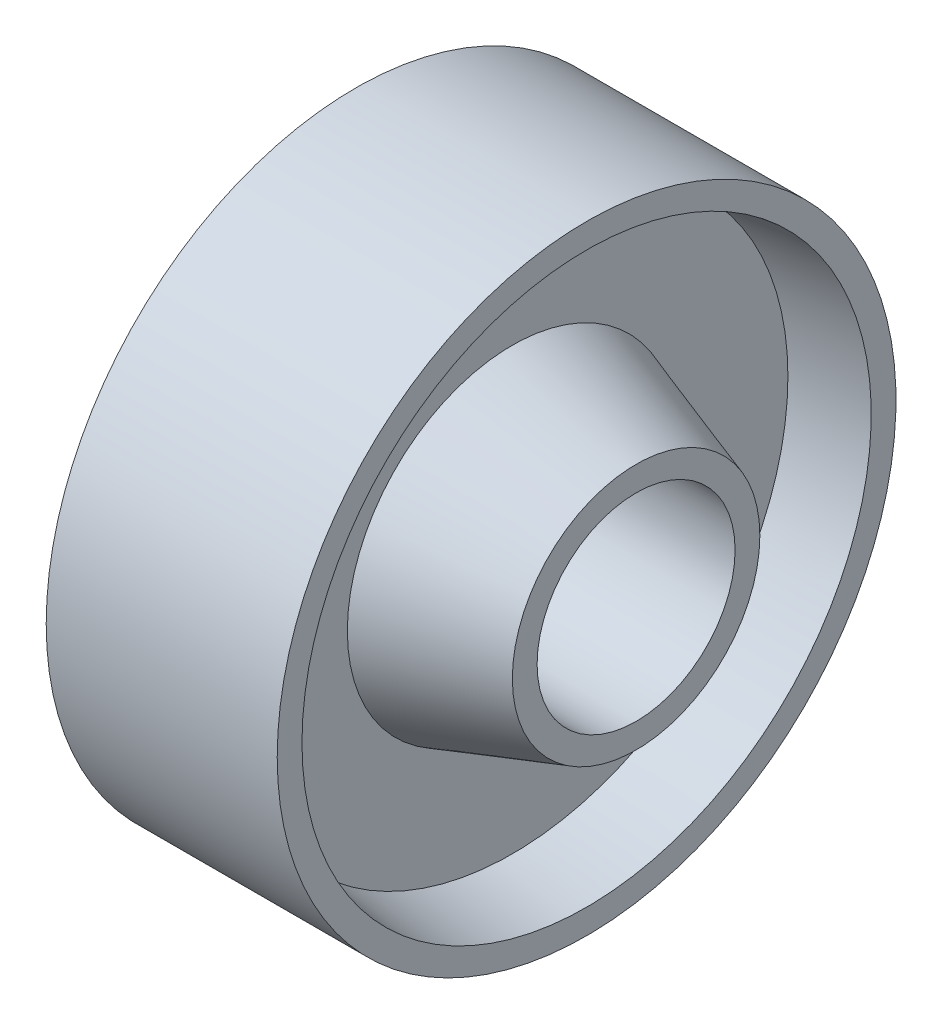
ISO-10303-21;
HEADER;
FILE_DESCRIPTION(('STEP AP214'),'2;1');
FILE_NAME('part.step','',(''),(''),'','','');
FILE_SCHEMA(('AUTOMOTIVE_DESIGN { 1 0 10303 214 1 1 1 1 }'));
ENDSEC;
DATA;
#1=APPLICATION_CONTEXT('core data for automotive mechanical design processes');
#2=APPLICATION_PROTOCOL_DEFINITION('international standard','automotive_design',2000,#1);
#3=PRODUCT_CONTEXT('',#1,'mechanical');
#4=PRODUCT('Part','Part','',(#3));
#5=PRODUCT_RELATED_PRODUCT_CATEGORY('part','',(#4));
#6=PRODUCT_DEFINITION_FORMATION('','',#4);
#7=PRODUCT_DEFINITION_CONTEXT('part definition',#1,'design');
#8=PRODUCT_DEFINITION('design','',#6,#7);
#9=PRODUCT_DEFINITION_SHAPE('','',#8);
#10=(LENGTH_UNIT() NAMED_UNIT(*) SI_UNIT(.MILLI.,.METRE.));
#11=(NAMED_UNIT(*) PLANE_ANGLE_UNIT() SI_UNIT($,.RADIAN.));
#12=(NAMED_UNIT(*) SI_UNIT($,.STERADIAN.) SOLID_ANGLE_UNIT());
#13=UNCERTAINTY_MEASURE_WITH_UNIT(LENGTH_MEASURE(1.E-05),#10,'distance_accuracy_value','');
#14=(GEOMETRIC_REPRESENTATION_CONTEXT(3) GLOBAL_UNCERTAINTY_ASSIGNED_CONTEXT((#13)) GLOBAL_UNIT_ASSIGNED_CONTEXT((#10,
#11,#12)) REPRESENTATION_CONTEXT('',''));
#15=CARTESIAN_POINT('',(0.,0.,0.));
#16=DIRECTION('',(0.,0.,1.));
#17=DIRECTION('',(1.,0.,0.));
#18=AXIS2_PLACEMENT_3D('',#15,#16,#17);
#19=CARTESIAN_POINT('',(14.,0.,0.));
#20=DIRECTION('',(1.,0.,0.));
#21=DIRECTION('',(0.,0.,-1.));
#22=AXIS2_PLACEMENT_3D('',#19,#20,#21);
#23=CONICAL_SURFACE('',#22,34.5,0.121376391577972);
#24=CARTESIAN_POINT('',(5.,0.,0.));
#25=DIRECTION('',(-1.,0.,0.));
#26=DIRECTION('',(0.,0.,1.));
#27=AXIS2_PLACEMENT_3D('',#24,#25,#26);
#28=CIRCLE('',#27,33.4022162399532);
#29=CARTESIAN_POINT('',(5.,0.,33.4022162399532));
#30=VERTEX_POINT('',#29);
#31=EDGE_CURVE('E73',#30,#30,#28,.T.);
#32=ORIENTED_EDGE('',*,*,#31,.T.);
#33=EDGE_LOOP('',(#32));
#34=FACE_BOUND('',#33,.T.);
#35=CARTESIAN_POINT('',(14.,0.,0.));
#36=DIRECTION('',(-1.,0.,0.));
#37=DIRECTION('',(0.,0.,1.));
#38=AXIS2_PLACEMENT_3D('',#35,#36,#37);
#39=CIRCLE('',#38,34.5);
#40=CARTESIAN_POINT('',(14.,0.,34.5));
#41=VERTEX_POINT('',#40);
#42=EDGE_CURVE('E10',#41,#41,#39,.T.);
#43=ORIENTED_EDGE('',*,*,#42,.F.);
#44=EDGE_LOOP('',(#43));
#45=FACE_BOUND('',#44,.T.);
#46=ADVANCED_FACE('F33',(#34,#45),#23,.F.);
#47=CARTESIAN_POINT('',(14.,0.,0.));
#48=DIRECTION('',(1.,0.,0.));
#49=DIRECTION('',(0.,0.,-1.));
#50=AXIS2_PLACEMENT_3D('',#47,#48,#49);
#51=PLANE('',#50);
#52=ORIENTED_EDGE('',*,*,#42,.T.);
#53=EDGE_LOOP('',(#52));
#54=FACE_BOUND('',#53,.T.);
#55=CARTESIAN_POINT('',(14.,0.,0.));
#56=DIRECTION('',(-1.,0.,0.));
#57=DIRECTION('',(0.,0.,1.));
#58=AXIS2_PLACEMENT_3D('',#55,#56,#57);
#59=CIRCLE('',#58,37.5);
#60=CARTESIAN_POINT('',(14.,0.,37.5));
#61=VERTEX_POINT('',#60);
#62=EDGE_CURVE('E39',#61,#61,#59,.T.);
#63=ORIENTED_EDGE('',*,*,#62,.F.);
#64=EDGE_LOOP('',(#63));
#65=FACE_BOUND('',#64,.T.);
#66=ADVANCED_FACE('F91',(#54,#65),#51,.T.);
#67=CARTESIAN_POINT('',(-33.6582240773412,0.,0.));
#68=DIRECTION('',(-1.,0.,0.));
#69=DIRECTION('',(0.,0.,1.));
#70=AXIS2_PLACEMENT_3D('',#67,#68,#69);
#71=CYLINDRICAL_SURFACE('',#70,37.5);
#72=ORIENTED_EDGE('',*,*,#62,.T.);
#73=EDGE_LOOP('',(#72));
#74=FACE_BOUND('',#73,.T.);
#75=CARTESIAN_POINT('',(-14.,0.,0.));
#76=DIRECTION('',(-1.,0.,0.));
#77=DIRECTION('',(0.,0.,1.));
#78=AXIS2_PLACEMENT_3D('',#75,#76,#77);
#79=CIRCLE('',#78,37.5);
#80=CARTESIAN_POINT('',(-14.,0.,37.5));
#81=VERTEX_POINT('',#80);
#82=EDGE_CURVE('E43',#81,#81,#79,.T.);
#83=ORIENTED_EDGE('',*,*,#82,.F.);
#84=EDGE_LOOP('',(#83));
#85=FACE_BOUND('',#84,.T.);
#86=ADVANCED_FACE('F95',(#74,#85),#71,.T.);
#87=CARTESIAN_POINT('',(-14.,0.,0.));
#88=DIRECTION('',(1.,0.,0.));
#89=DIRECTION('',(0.,0.,-1.));
#90=AXIS2_PLACEMENT_3D('',#87,#88,#89);
#91=PLANE('',#90);
#92=CARTESIAN_POINT('',(-14.,0.,0.));
#93=DIRECTION('',(-1.,0.,0.));
#94=DIRECTION('',(0.,0.,1.));
#95=AXIS2_PLACEMENT_3D('',#92,#93,#94);
#96=CIRCLE('',#95,34.5);
#97=CARTESIAN_POINT('',(-14.,0.,34.5));
#98=VERTEX_POINT('',#97);
#99=EDGE_CURVE('E47',#98,#98,#96,.T.);
#100=ORIENTED_EDGE('',*,*,#99,.F.);
#101=EDGE_LOOP('',(#100));
#102=FACE_BOUND('',#101,.T.);
#103=ORIENTED_EDGE('',*,*,#82,.T.);
#104=EDGE_LOOP('',(#103));
#105=FACE_BOUND('',#104,.T.);
#106=ADVANCED_FACE('F99',(#102,#105),#91,.F.);
#107=CARTESIAN_POINT('',(-14.,0.,0.));
#108=DIRECTION('',(-1.,0.,0.));
#109=DIRECTION('',(0.,0.,1.));
#110=AXIS2_PLACEMENT_3D('',#107,#108,#109);
#111=CONICAL_SURFACE('',#110,34.5,0.121376391577971);
#112=CARTESIAN_POINT('',(-5.,0.,0.));
#113=DIRECTION('',(-1.,0.,0.));
#114=DIRECTION('',(0.,0.,1.));
#115=AXIS2_PLACEMENT_3D('',#112,#113,#114);
#116=CIRCLE('',#115,33.4022162399532);
#117=CARTESIAN_POINT('',(-5.,0.,33.4022162399532));
#118=VERTEX_POINT('',#117);
#119=EDGE_CURVE('E52',#118,#118,#116,.T.);
#120=ORIENTED_EDGE('',*,*,#119,.F.);
#121=EDGE_LOOP('',(#120));
#122=FACE_BOUND('',#121,.T.);
#123=ORIENTED_EDGE('',*,*,#99,.T.);
#124=EDGE_LOOP('',(#123));
#125=FACE_BOUND('',#124,.T.);
#126=ADVANCED_FACE('F105',(#122,#125),#111,.F.);
#127=CARTESIAN_POINT('',(-5.,0.,0.));
#128=DIRECTION('',(1.,0.,0.));
#129=DIRECTION('',(0.,0.,-1.));
#130=AXIS2_PLACEMENT_3D('',#127,#128,#129);
#131=PLANE('',#130);
#132=CARTESIAN_POINT('',(-5.,0.,0.));
#133=DIRECTION('',(-1.,0.,0.));
#134=DIRECTION('',(0.,0.,1.));
#135=AXIS2_PLACEMENT_3D('',#132,#133,#134);
#136=CIRCLE('',#135,20.);
#137=CARTESIAN_POINT('',(-5.,0.,20.));
#138=VERTEX_POINT('',#137);
#139=EDGE_CURVE('E55',#138,#138,#136,.T.);
#140=ORIENTED_EDGE('',*,*,#139,.F.);
#141=EDGE_LOOP('',(#140));
#142=FACE_BOUND('',#141,.T.);
#143=ORIENTED_EDGE('',*,*,#119,.T.);
#144=EDGE_LOOP('',(#143));
#145=FACE_BOUND('',#144,.T.);
#146=ADVANCED_FACE('F109',(#142,#145),#131,.F.);
#147=CARTESIAN_POINT('',(-5.,0.,0.));
#148=DIRECTION('',(1.,0.,0.));
#149=DIRECTION('',(0.,0.,-1.));
#150=AXIS2_PLACEMENT_3D('',#147,#148,#149);
#151=CONICAL_SURFACE('',#150,20.,0.321750554396642);
#152=CARTESIAN_POINT('',(-20.,0.,0.));
#153=DIRECTION('',(-1.,0.,0.));
#154=DIRECTION('',(0.,0.,1.));
#155=AXIS2_PLACEMENT_3D('',#152,#153,#154);
#156=CIRCLE('',#155,15.);
#157=CARTESIAN_POINT('',(-20.,0.,15.));
#158=VERTEX_POINT('',#157);
#159=EDGE_CURVE('E58',#158,#158,#156,.T.);
#160=ORIENTED_EDGE('',*,*,#159,.F.);
#161=EDGE_LOOP('',(#160));
#162=FACE_BOUND('',#161,.T.);
#163=ORIENTED_EDGE('',*,*,#139,.T.);
#164=EDGE_LOOP('',(#163));
#165=FACE_BOUND('',#164,.T.);
#166=ADVANCED_FACE('F113',(#162,#165),#151,.T.);
#167=CARTESIAN_POINT('',(-20.,0.,0.));
#168=DIRECTION('',(1.,0.,0.));
#169=DIRECTION('',(0.,0.,-1.));
#170=AXIS2_PLACEMENT_3D('',#167,#168,#169);
#171=PLANE('',#170);
#172=CARTESIAN_POINT('',(-20.,0.,0.));
#173=DIRECTION('',(-1.,0.,0.));
#174=DIRECTION('',(0.,0.,1.));
#175=AXIS2_PLACEMENT_3D('',#172,#173,#174);
#176=CIRCLE('',#175,12.);
#177=CARTESIAN_POINT('',(-20.,0.,12.));
#178=VERTEX_POINT('',#177);
#179=EDGE_CURVE('E61',#178,#178,#176,.T.);
#180=ORIENTED_EDGE('',*,*,#179,.F.);
#181=EDGE_LOOP('',(#180));
#182=FACE_BOUND('',#181,.T.);
#183=ORIENTED_EDGE('',*,*,#159,.T.);
#184=EDGE_LOOP('',(#183));
#185=FACE_BOUND('',#184,.T.);
#186=ADVANCED_FACE('F117',(#182,#185),#171,.F.);
#187=CARTESIAN_POINT('',(-33.6582240773412,0.,0.));
#188=DIRECTION('',(-1.,0.,0.));
#189=DIRECTION('',(0.,0.,1.));
#190=AXIS2_PLACEMENT_3D('',#187,#188,#189);
#191=CYLINDRICAL_SURFACE('',#190,12.);
#192=CARTESIAN_POINT('',(20.,0.,0.));
#193=DIRECTION('',(-1.,0.,0.));
#194=DIRECTION('',(0.,0.,1.));
#195=AXIS2_PLACEMENT_3D('',#192,#193,#194);
#196=CIRCLE('',#195,12.);
#197=CARTESIAN_POINT('',(20.,0.,12.));
#198=VERTEX_POINT('',#197);
#199=EDGE_CURVE('E64',#198,#198,#196,.T.);
#200=ORIENTED_EDGE('',*,*,#199,.F.);
#201=EDGE_LOOP('',(#200));
#202=FACE_BOUND('',#201,.T.);
#203=ORIENTED_EDGE('',*,*,#179,.T.);
#204=EDGE_LOOP('',(#203));
#205=FACE_BOUND('',#204,.T.);
#206=ADVANCED_FACE('F121',(#202,#205),#191,.F.);
#207=CARTESIAN_POINT('',(20.,0.,0.));
#208=DIRECTION('',(1.,0.,0.));
#209=DIRECTION('',(0.,0.,-1.));
#210=AXIS2_PLACEMENT_3D('',#207,#208,#209);
#211=PLANE('',#210);
#212=ORIENTED_EDGE('',*,*,#199,.T.);
#213=EDGE_LOOP('',(#212));
#214=FACE_BOUND('',#213,.T.);
#215=CARTESIAN_POINT('',(20.,0.,0.));
#216=DIRECTION('',(-1.,0.,0.));
#217=DIRECTION('',(0.,0.,1.));
#218=AXIS2_PLACEMENT_3D('',#215,#216,#217);
#219=CIRCLE('',#218,15.);
#220=CARTESIAN_POINT('',(20.,0.,15.));
#221=VERTEX_POINT('',#220);
#222=EDGE_CURVE('E67',#221,#221,#219,.T.);
#223=ORIENTED_EDGE('',*,*,#222,.F.);
#224=EDGE_LOOP('',(#223));
#225=FACE_BOUND('',#224,.T.);
#226=ADVANCED_FACE('F87',(#214,#225),#211,.T.);
#227=CARTESIAN_POINT('',(5.,0.,0.));
#228=DIRECTION('',(-1.,0.,0.));
#229=DIRECTION('',(0.,0.,1.));
#230=AXIS2_PLACEMENT_3D('',#227,#228,#229);
#231=CONICAL_SURFACE('',#230,20.,0.321750554396642);
#232=ORIENTED_EDGE('',*,*,#222,.T.);
#233=EDGE_LOOP('',(#232));
#234=FACE_BOUND('',#233,.T.);
#235=CARTESIAN_POINT('',(5.,0.,0.));
#236=DIRECTION('',(-1.,0.,0.));
#237=DIRECTION('',(0.,0.,1.));
#238=AXIS2_PLACEMENT_3D('',#235,#236,#237);
#239=CIRCLE('',#238,20.);
#240=CARTESIAN_POINT('',(5.,0.,20.));
#241=VERTEX_POINT('',#240);
#242=EDGE_CURVE('E70',#241,#241,#239,.T.);
#243=ORIENTED_EDGE('',*,*,#242,.F.);
#244=EDGE_LOOP('',(#243));
#245=FACE_BOUND('',#244,.T.);
#246=ADVANCED_FACE('F81',(#234,#245),#231,.T.);
#247=CARTESIAN_POINT('',(5.,0.,0.));
#248=DIRECTION('',(1.,0.,0.));
#249=DIRECTION('',(0.,0.,-1.));
#250=AXIS2_PLACEMENT_3D('',#247,#248,#249);
#251=PLANE('',#250);
#252=ORIENTED_EDGE('',*,*,#242,.T.);
#253=EDGE_LOOP('',(#252));
#254=FACE_BOUND('',#253,.T.);
#255=ORIENTED_EDGE('',*,*,#31,.F.);
#256=EDGE_LOOP('',(#255));
#257=FACE_BOUND('',#256,.T.);
#258=ADVANCED_FACE('F79',(#254,#257),#251,.T.);
#259=CLOSED_SHELL('',(#46,#66,#86,#106,#126,#146,#166,#186,#206,#226,#246,#258));
#260=MANIFOLD_SOLID_BREP('B2',#259);
#261=ADVANCED_BREP_SHAPE_REPRESENTATION('',(#18,#260),#14);
#262=SHAPE_DEFINITION_REPRESENTATION(#9,#261);
ENDSEC;
END-ISO-10303-21;
